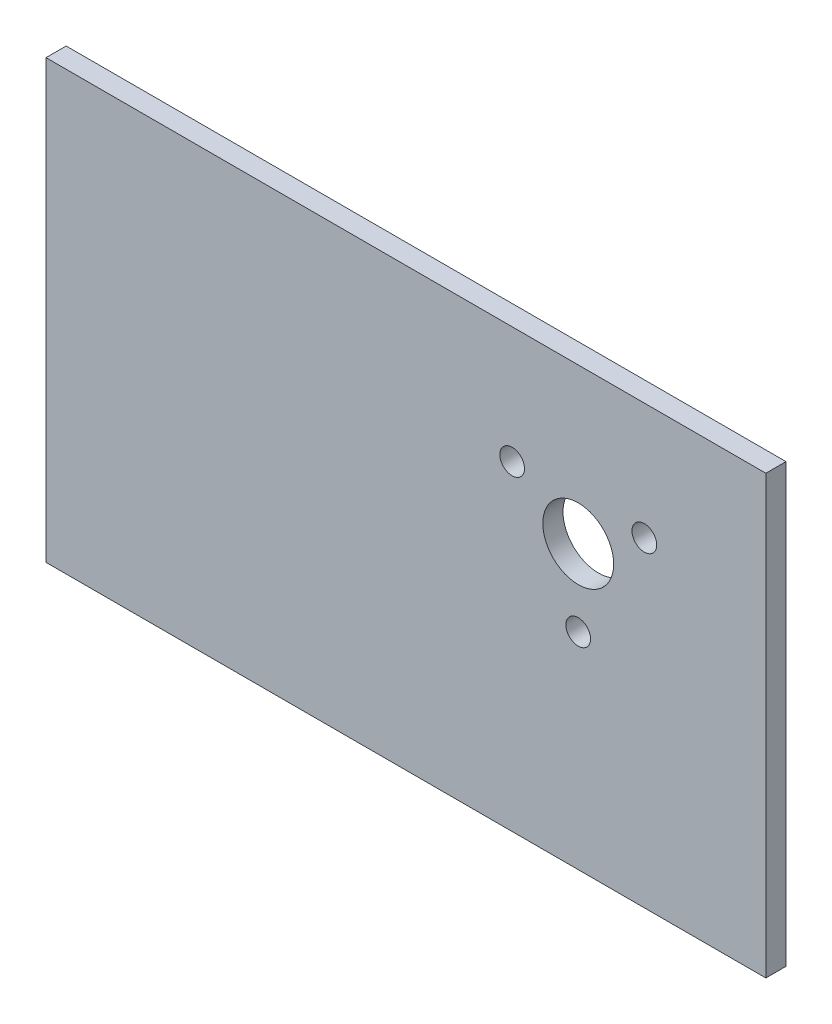
ISO-10303-21;
HEADER;
FILE_DESCRIPTION(('STEP AP214'),'2;1');
FILE_NAME('part.step','',(''),(''),'','','');
FILE_SCHEMA(('AUTOMOTIVE_DESIGN { 1 0 10303 214 1 1 1 1 }'));
ENDSEC;
DATA;
#1=APPLICATION_CONTEXT('core data for automotive mechanical design processes');
#2=APPLICATION_PROTOCOL_DEFINITION('international standard','automotive_design',2000,#1);
#3=PRODUCT_CONTEXT('',#1,'mechanical');
#4=PRODUCT('Part','Part','',(#3));
#5=PRODUCT_RELATED_PRODUCT_CATEGORY('part','',(#4));
#6=PRODUCT_DEFINITION_FORMATION('','',#4);
#7=PRODUCT_DEFINITION_CONTEXT('part definition',#1,'design');
#8=PRODUCT_DEFINITION('design','',#6,#7);
#9=PRODUCT_DEFINITION_SHAPE('','',#8);
#10=(LENGTH_UNIT() NAMED_UNIT(*) SI_UNIT(.MILLI.,.METRE.));
#11=(NAMED_UNIT(*) PLANE_ANGLE_UNIT() SI_UNIT($,.RADIAN.));
#12=(NAMED_UNIT(*) SI_UNIT($,.STERADIAN.) SOLID_ANGLE_UNIT());
#13=UNCERTAINTY_MEASURE_WITH_UNIT(LENGTH_MEASURE(1.E-05),#10,'distance_accuracy_value','');
#14=(GEOMETRIC_REPRESENTATION_CONTEXT(3) GLOBAL_UNCERTAINTY_ASSIGNED_CONTEXT((#13)) GLOBAL_UNIT_ASSIGNED_CONTEXT((#10,
#11,#12)) REPRESENTATION_CONTEXT('',''));
#15=CARTESIAN_POINT('',(0.,0.,0.));
#16=DIRECTION('',(0.,0.,1.));
#17=DIRECTION('',(1.,0.,0.));
#18=AXIS2_PLACEMENT_3D('',#15,#16,#17);
#19=CARTESIAN_POINT('',(0.,0.,6.35));
#20=DIRECTION('',(0.,0.,-1.));
#21=DIRECTION('',(-1.,0.,0.));
#22=AXIS2_PLACEMENT_3D('',#19,#20,#21);
#23=PLANE('',#22);
#24=CARTESIAN_POINT('',(39.37,11.0653971866369,6.35));
#25=DIRECTION('',(0.,0.,1.));
#26=DIRECTION('',(1.,0.,0.));
#27=AXIS2_PLACEMENT_3D('',#24,#25,#26);
#28=CIRCLE('',#27,3.89254999999997);
#29=CARTESIAN_POINT('',(43.26255,11.0653971866369,6.35));
#30=VERTEX_POINT('',#29);
#31=EDGE_CURVE('E121',#30,#30,#28,.T.);
#32=ORIENTED_EDGE('',*,*,#31,.F.);
#33=EDGE_LOOP('',(#32));
#34=FACE_BOUND('',#33,.T.);
#35=CARTESIAN_POINT('',(39.37,35.1155,6.35));
#36=DIRECTION('',(0.,0.,1.));
#37=DIRECTION('',(1.,0.,0.));
#38=AXIS2_PLACEMENT_3D('',#35,#36,#37);
#39=CIRCLE('',#38,11.1633);
#40=CARTESIAN_POINT('',(50.5333,35.1155,6.35));
#41=VERTEX_POINT('',#40);
#42=EDGE_CURVE('E100',#41,#41,#39,.T.);
#43=ORIENTED_EDGE('',*,*,#42,.F.);
#44=EDGE_LOOP('',(#43));
#45=FACE_BOUND('',#44,.T.);
#46=DIRECTION('',(0.,1.,0.));
#47=VECTOR('',#46,1.);
#48=CARTESIAN_POINT('',(98.500577225156,83.9325120538799,6.35));
#49=LINE('',#48,#47);
#50=CARTESIAN_POINT('',(98.500577225156,-53.848,6.35));
#51=VERTEX_POINT('',#50);
#52=CARTESIAN_POINT('',(98.500577225156,83.9325120538799,6.35));
#53=VERTEX_POINT('',#52);
#54=EDGE_CURVE('E85',#51,#53,#49,.T.);
#55=ORIENTED_EDGE('',*,*,#54,.T.);
#56=DIRECTION('',(-1.,0.,0.));
#57=VECTOR('',#56,1.);
#58=CARTESIAN_POINT('',(98.500577225156,83.9325120538799,6.35));
#59=LINE('',#58,#57);
#60=CARTESIAN_POINT('',(-128.379470198652,83.9325120538799,6.35));
#61=VERTEX_POINT('',#60);
#62=EDGE_CURVE('E80',#53,#61,#59,.T.);
#63=ORIENTED_EDGE('',*,*,#62,.T.);
#64=DIRECTION('',(0.,-1.,0.));
#65=VECTOR('',#64,1.);
#66=CARTESIAN_POINT('',(-128.379470198652,83.9325120538799,6.35));
#67=LINE('',#66,#65);
#68=CARTESIAN_POINT('',(-128.379470198652,-53.848,6.35));
#69=VERTEX_POINT('',#68);
#70=EDGE_CURVE('E83',#61,#69,#67,.T.);
#71=ORIENTED_EDGE('',*,*,#70,.T.);
#72=DIRECTION('',(1.,0.,0.));
#73=VECTOR('',#72,1.);
#74=CARTESIAN_POINT('',(98.500577225156,-53.848,6.35));
#75=LINE('',#74,#73);
#76=EDGE_CURVE('E50',#69,#51,#75,.T.);
#77=ORIENTED_EDGE('',*,*,#76,.T.);
#78=EDGE_LOOP('',(#55,#63,#71,#77));
#79=FACE_BOUND('',#78,.T.);
#80=CARTESIAN_POINT('',(60.198,47.1405514066815,6.35));
#81=DIRECTION('',(0.,0.,1.));
#82=DIRECTION('',(1.,0.,0.));
#83=AXIS2_PLACEMENT_3D('',#80,#81,#82);
#84=CIRCLE('',#83,3.89255);
#85=CARTESIAN_POINT('',(64.09055,47.1405514066815,6.35));
#86=VERTEX_POINT('',#85);
#87=EDGE_CURVE('E115',#86,#86,#84,.T.);
#88=ORIENTED_EDGE('',*,*,#87,.F.);
#89=EDGE_LOOP('',(#88));
#90=FACE_BOUND('',#89,.T.);
#91=CARTESIAN_POINT('',(18.542,47.1405514066815,6.35));
#92=DIRECTION('',(0.,0.,1.));
#93=DIRECTION('',(1.,0.,0.));
#94=AXIS2_PLACEMENT_3D('',#91,#92,#93);
#95=CIRCLE('',#94,3.89255);
#96=CARTESIAN_POINT('',(22.43455,47.1405514066815,6.35));
#97=VERTEX_POINT('',#96);
#98=EDGE_CURVE('E127',#97,#97,#95,.T.);
#99=ORIENTED_EDGE('',*,*,#98,.F.);
#100=EDGE_LOOP('',(#99));
#101=FACE_BOUND('',#100,.T.);
#102=ADVANCED_FACE('F33',(#34,#45,#79,#90,#101),#23,.F.);
#103=CARTESIAN_POINT('',(0.,0.,0.));
#104=DIRECTION('',(0.,0.,-1.));
#105=DIRECTION('',(-1.,0.,0.));
#106=AXIS2_PLACEMENT_3D('',#103,#104,#105);
#107=PLANE('',#106);
#108=CARTESIAN_POINT('',(39.37,11.0653971866369,0.));
#109=DIRECTION('',(0.,0.,1.));
#110=DIRECTION('',(1.,0.,0.));
#111=AXIS2_PLACEMENT_3D('',#108,#109,#110);
#112=CIRCLE('',#111,3.89254999999997);
#113=CARTESIAN_POINT('',(43.26255,11.0653971866369,0.));
#114=VERTEX_POINT('',#113);
#115=EDGE_CURVE('E124',#114,#114,#112,.T.);
#116=ORIENTED_EDGE('',*,*,#115,.T.);
#117=EDGE_LOOP('',(#116));
#118=FACE_BOUND('',#117,.T.);
#119=CARTESIAN_POINT('',(39.37,35.1155,0.));
#120=DIRECTION('',(0.,0.,1.));
#121=DIRECTION('',(1.,0.,0.));
#122=AXIS2_PLACEMENT_3D('',#119,#120,#121);
#123=CIRCLE('',#122,11.1633);
#124=CARTESIAN_POINT('',(50.5333,35.1155,0.));
#125=VERTEX_POINT('',#124);
#126=EDGE_CURVE('E112',#125,#125,#123,.T.);
#127=ORIENTED_EDGE('',*,*,#126,.T.);
#128=EDGE_LOOP('',(#127));
#129=FACE_BOUND('',#128,.T.);
#130=DIRECTION('',(0.,1.,0.));
#131=VECTOR('',#130,1.);
#132=CARTESIAN_POINT('',(98.500577225156,83.9325120538799,0.));
#133=LINE('',#132,#131);
#134=CARTESIAN_POINT('',(98.500577225156,-53.848,0.));
#135=VERTEX_POINT('',#134);
#136=CARTESIAN_POINT('',(98.500577225156,83.9325120538799,0.));
#137=VERTEX_POINT('',#136);
#138=EDGE_CURVE('E97',#135,#137,#133,.T.);
#139=ORIENTED_EDGE('',*,*,#138,.F.);
#140=DIRECTION('',(1.,0.,0.));
#141=VECTOR('',#140,1.);
#142=CARTESIAN_POINT('',(98.500577225156,-53.848,0.));
#143=LINE('',#142,#141);
#144=CARTESIAN_POINT('',(-128.379470198652,-53.848,0.));
#145=VERTEX_POINT('',#144);
#146=EDGE_CURVE('E73',#145,#135,#143,.T.);
#147=ORIENTED_EDGE('',*,*,#146,.F.);
#148=DIRECTION('',(0.,-1.,0.));
#149=VECTOR('',#148,1.);
#150=CARTESIAN_POINT('',(-128.379470198652,83.9325120538799,0.));
#151=LINE('',#150,#149);
#152=CARTESIAN_POINT('',(-128.379470198652,83.9325120538799,0.));
#153=VERTEX_POINT('',#152);
#154=EDGE_CURVE('E67',#153,#145,#151,.T.);
#155=ORIENTED_EDGE('',*,*,#154,.F.);
#156=DIRECTION('',(-1.,0.,0.));
#157=VECTOR('',#156,1.);
#158=CARTESIAN_POINT('',(98.500577225156,83.9325120538799,0.));
#159=LINE('',#158,#157);
#160=EDGE_CURVE('E89',#137,#153,#159,.T.);
#161=ORIENTED_EDGE('',*,*,#160,.F.);
#162=EDGE_LOOP('',(#139,#147,#155,#161));
#163=FACE_BOUND('',#162,.T.);
#164=CARTESIAN_POINT('',(60.198,47.1405514066815,0.));
#165=DIRECTION('',(0.,0.,1.));
#166=DIRECTION('',(1.,0.,0.));
#167=AXIS2_PLACEMENT_3D('',#164,#165,#166);
#168=CIRCLE('',#167,3.89255);
#169=CARTESIAN_POINT('',(64.09055,47.1405514066815,0.));
#170=VERTEX_POINT('',#169);
#171=EDGE_CURVE('E118',#170,#170,#168,.T.);
#172=ORIENTED_EDGE('',*,*,#171,.T.);
#173=EDGE_LOOP('',(#172));
#174=FACE_BOUND('',#173,.T.);
#175=CARTESIAN_POINT('',(18.542,47.1405514066815,0.));
#176=DIRECTION('',(0.,0.,1.));
#177=DIRECTION('',(1.,0.,0.));
#178=AXIS2_PLACEMENT_3D('',#175,#176,#177);
#179=CIRCLE('',#178,3.89255);
#180=CARTESIAN_POINT('',(22.43455,47.1405514066815,0.));
#181=VERTEX_POINT('',#180);
#182=EDGE_CURVE('E130',#181,#181,#179,.T.);
#183=ORIENTED_EDGE('',*,*,#182,.T.);
#184=EDGE_LOOP('',(#183));
#185=FACE_BOUND('',#184,.T.);
#186=ADVANCED_FACE('F108',(#118,#129,#163,#174,#185),#107,.T.);
#187=CARTESIAN_POINT('',(98.500577225156,83.9325120538799,6.35));
#188=DIRECTION('',(-1.,0.,0.));
#189=DIRECTION('',(0.,-1.,0.));
#190=AXIS2_PLACEMENT_3D('',#187,#188,#189);
#191=PLANE('',#190);
#192=ORIENTED_EDGE('',*,*,#138,.T.);
#193=DIRECTION('',(0.,0.,-1.));
#194=VECTOR('',#193,1.);
#195=CARTESIAN_POINT('',(98.500577225156,83.9325120538799,6.35));
#196=LINE('',#195,#194);
#197=EDGE_CURVE('E11',#53,#137,#196,.T.);
#198=ORIENTED_EDGE('',*,*,#197,.F.);
#199=ORIENTED_EDGE('',*,*,#54,.F.);
#200=DIRECTION('',(0.,0.,-1.));
#201=VECTOR('',#200,1.);
#202=CARTESIAN_POINT('',(98.500577225156,-53.848,6.35));
#203=LINE('',#202,#201);
#204=EDGE_CURVE('E93',#51,#135,#203,.T.);
#205=ORIENTED_EDGE('',*,*,#204,.T.);
#206=EDGE_LOOP('',(#192,#198,#199,#205));
#207=FACE_BOUND('',#206,.T.);
#208=ADVANCED_FACE('F35',(#207),#191,.F.);
#209=CARTESIAN_POINT('',(98.500577225156,83.9325120538799,6.35));
#210=DIRECTION('',(0.,-1.,0.));
#211=DIRECTION('',(1.,0.,0.));
#212=AXIS2_PLACEMENT_3D('',#209,#210,#211);
#213=PLANE('',#212);
#214=ORIENTED_EDGE('',*,*,#160,.T.);
#215=DIRECTION('',(0.,0.,-1.));
#216=VECTOR('',#215,1.);
#217=CARTESIAN_POINT('',(-128.379470198652,83.9325120538799,6.35));
#218=LINE('',#217,#216);
#219=EDGE_CURVE('E42',#61,#153,#218,.T.);
#220=ORIENTED_EDGE('',*,*,#219,.F.);
#221=ORIENTED_EDGE('',*,*,#62,.F.);
#222=ORIENTED_EDGE('',*,*,#197,.T.);
#223=EDGE_LOOP('',(#214,#220,#221,#222));
#224=FACE_BOUND('',#223,.T.);
#225=ADVANCED_FACE('F88',(#224),#213,.F.);
#226=CARTESIAN_POINT('',(-128.379470198652,83.9325120538799,6.35));
#227=DIRECTION('',(1.,0.,0.));
#228=DIRECTION('',(0.,1.,0.));
#229=AXIS2_PLACEMENT_3D('',#226,#227,#228);
#230=PLANE('',#229);
#231=ORIENTED_EDGE('',*,*,#154,.T.);
#232=DIRECTION('',(0.,0.,-1.));
#233=VECTOR('',#232,1.);
#234=CARTESIAN_POINT('',(-128.379470198652,-53.848,6.35));
#235=LINE('',#234,#233);
#236=EDGE_CURVE('E90',#69,#145,#235,.T.);
#237=ORIENTED_EDGE('',*,*,#236,.F.);
#238=ORIENTED_EDGE('',*,*,#70,.F.);
#239=ORIENTED_EDGE('',*,*,#219,.T.);
#240=EDGE_LOOP('',(#231,#237,#238,#239));
#241=FACE_BOUND('',#240,.T.);
#242=ADVANCED_FACE('F91',(#241),#230,.F.);
#243=CARTESIAN_POINT('',(98.500577225156,-53.848,6.35));
#244=DIRECTION('',(0.,1.,0.));
#245=DIRECTION('',(-1.,0.,0.));
#246=AXIS2_PLACEMENT_3D('',#243,#244,#245);
#247=PLANE('',#246);
#248=ORIENTED_EDGE('',*,*,#146,.T.);
#249=ORIENTED_EDGE('',*,*,#204,.F.);
#250=ORIENTED_EDGE('',*,*,#76,.F.);
#251=ORIENTED_EDGE('',*,*,#236,.T.);
#252=EDGE_LOOP('',(#248,#249,#250,#251));
#253=FACE_BOUND('',#252,.T.);
#254=ADVANCED_FACE('F105',(#253),#247,.F.);
#255=CARTESIAN_POINT('',(39.37,35.1155,6.35));
#256=DIRECTION('',(0.,0.,-1.));
#257=DIRECTION('',(-1.,0.,0.));
#258=AXIS2_PLACEMENT_3D('',#255,#256,#257);
#259=CYLINDRICAL_SURFACE('',#258,11.1633);
#260=ORIENTED_EDGE('',*,*,#42,.T.);
#261=EDGE_LOOP('',(#260));
#262=FACE_BOUND('',#261,.T.);
#263=ORIENTED_EDGE('',*,*,#126,.F.);
#264=EDGE_LOOP('',(#263));
#265=FACE_BOUND('',#264,.T.);
#266=ADVANCED_FACE('F150',(#262,#265),#259,.F.);
#267=CARTESIAN_POINT('',(60.198,47.1405514066815,6.35));
#268=DIRECTION('',(0.,0.,-1.));
#269=DIRECTION('',(-1.,0.,0.));
#270=AXIS2_PLACEMENT_3D('',#267,#268,#269);
#271=CYLINDRICAL_SURFACE('',#270,3.89255);
#272=ORIENTED_EDGE('',*,*,#87,.T.);
#273=EDGE_LOOP('',(#272));
#274=FACE_BOUND('',#273,.T.);
#275=ORIENTED_EDGE('',*,*,#171,.F.);
#276=EDGE_LOOP('',(#275));
#277=FACE_BOUND('',#276,.T.);
#278=ADVANCED_FACE('F196',(#274,#277),#271,.F.);
#279=CARTESIAN_POINT('',(39.37,11.0653971866369,6.35));
#280=DIRECTION('',(0.,0.,-1.));
#281=DIRECTION('',(-1.,0.,0.));
#282=AXIS2_PLACEMENT_3D('',#279,#280,#281);
#283=CYLINDRICAL_SURFACE('',#282,3.89254999999997);
#284=ORIENTED_EDGE('',*,*,#31,.T.);
#285=EDGE_LOOP('',(#284));
#286=FACE_BOUND('',#285,.T.);
#287=ORIENTED_EDGE('',*,*,#115,.F.);
#288=EDGE_LOOP('',(#287));
#289=FACE_BOUND('',#288,.T.);
#290=ADVANCED_FACE('F204',(#286,#289),#283,.F.);
#291=CARTESIAN_POINT('',(18.542,47.1405514066815,6.35));
#292=DIRECTION('',(0.,0.,-1.));
#293=DIRECTION('',(-1.,0.,0.));
#294=AXIS2_PLACEMENT_3D('',#291,#292,#293);
#295=CYLINDRICAL_SURFACE('',#294,3.89255);
#296=ORIENTED_EDGE('',*,*,#98,.T.);
#297=EDGE_LOOP('',(#296));
#298=FACE_BOUND('',#297,.T.);
#299=ORIENTED_EDGE('',*,*,#182,.F.);
#300=EDGE_LOOP('',(#299));
#301=FACE_BOUND('',#300,.T.);
#302=ADVANCED_FACE('F136',(#298,#301),#295,.F.);
#303=CLOSED_SHELL('',(#102,#186,#208,#225,#242,#254,#266,#278,#290,#302));
#304=MANIFOLD_SOLID_BREP('B2',#303);
#305=ADVANCED_BREP_SHAPE_REPRESENTATION('',(#18,#304),#14);
#306=SHAPE_DEFINITION_REPRESENTATION(#9,#305);
ENDSEC;
END-ISO-10303-21;
